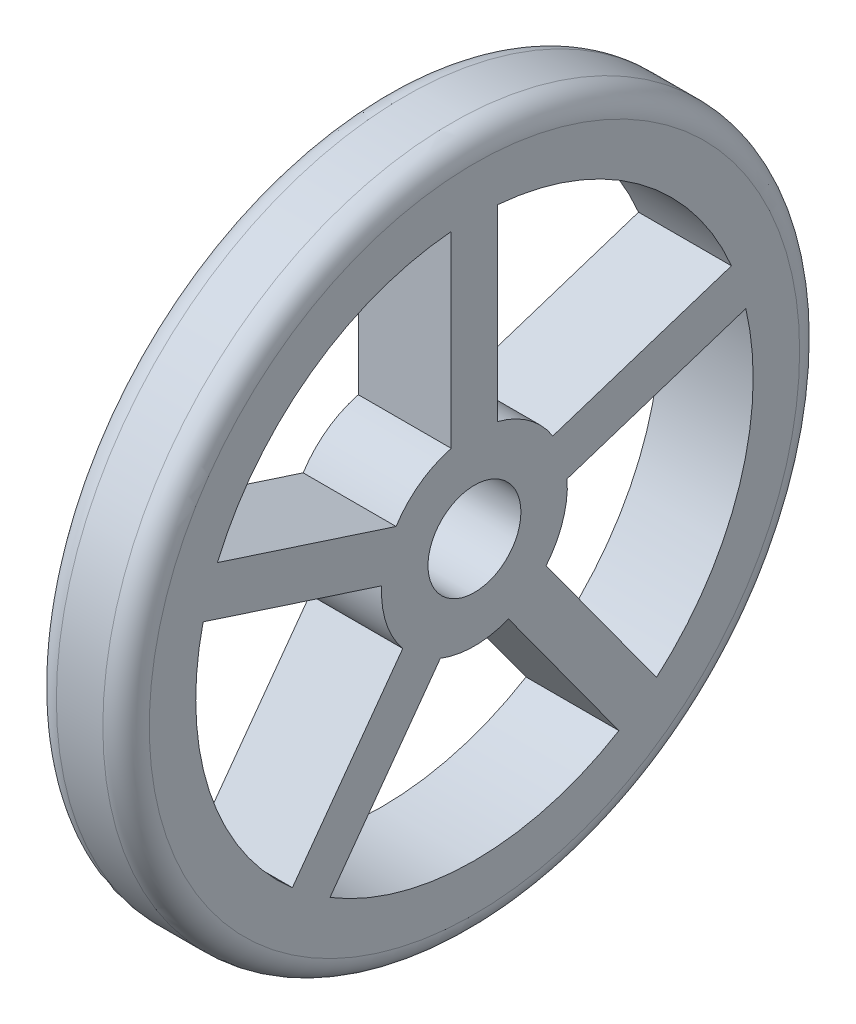
ISO-10303-21;
HEADER;
FILE_DESCRIPTION(('STEP AP214'),'2;1');
FILE_NAME('part.step','',(''),(''),'','','');
FILE_SCHEMA(('AUTOMOTIVE_DESIGN { 1 0 10303 214 1 1 1 1 }'));
ENDSEC;
DATA;
#1=APPLICATION_CONTEXT('core data for automotive mechanical design processes');
#2=APPLICATION_PROTOCOL_DEFINITION('international standard','automotive_design',2000,#1);
#3=PRODUCT_CONTEXT('',#1,'mechanical');
#4=PRODUCT('Part','Part','',(#3));
#5=PRODUCT_RELATED_PRODUCT_CATEGORY('part','',(#4));
#6=PRODUCT_DEFINITION_FORMATION('','',#4);
#7=PRODUCT_DEFINITION_CONTEXT('part definition',#1,'design');
#8=PRODUCT_DEFINITION('design','',#6,#7);
#9=PRODUCT_DEFINITION_SHAPE('','',#8);
#10=(LENGTH_UNIT() NAMED_UNIT(*) SI_UNIT(.MILLI.,.METRE.));
#11=(NAMED_UNIT(*) PLANE_ANGLE_UNIT() SI_UNIT($,.RADIAN.));
#12=(NAMED_UNIT(*) SI_UNIT($,.STERADIAN.) SOLID_ANGLE_UNIT());
#13=UNCERTAINTY_MEASURE_WITH_UNIT(LENGTH_MEASURE(1.E-05),#10,'distance_accuracy_value','');
#14=(GEOMETRIC_REPRESENTATION_CONTEXT(3) GLOBAL_UNCERTAINTY_ASSIGNED_CONTEXT((#13)) GLOBAL_UNIT_ASSIGNED_CONTEXT((#10,
#11,#12)) REPRESENTATION_CONTEXT('',''));
#15=CARTESIAN_POINT('',(0.,0.,0.));
#16=DIRECTION('',(0.,0.,1.));
#17=DIRECTION('',(1.,0.,0.));
#18=AXIS2_PLACEMENT_3D('',#15,#16,#17);
#19=CARTESIAN_POINT('',(40.,0.,0.));
#20=DIRECTION('',(1.,0.,0.));
#21=DIRECTION('',(0.,0.,-1.));
#22=AXIS2_PLACEMENT_3D('',#19,#20,#21);
#23=PLANE('',#22);
#24=CARTESIAN_POINT('',(40.,0.,0.));
#25=DIRECTION('',(1.,0.,0.));
#26=DIRECTION('',(0.,0.,-1.));
#27=AXIS2_PLACEMENT_3D('',#24,#25,#26);
#28=CIRCLE('',#27,140.);
#29=CARTESIAN_POINT('',(40.,0.,-140.));
#30=VERTEX_POINT('',#29);
#31=EDGE_CURVE('E11',#30,#30,#28,.T.);
#32=ORIENTED_EDGE('',*,*,#31,.T.);
#33=EDGE_LOOP('',(#32));
#34=FACE_BOUND('',#33,.T.);
#35=CARTESIAN_POINT('',(40.,0.,0.));
#36=DIRECTION('',(1.,0.,0.));
#37=DIRECTION('',(0.,0.,-1.));
#38=AXIS2_PLACEMENT_3D('',#35,#36,#37);
#39=CIRCLE('',#38,20.);
#40=CARTESIAN_POINT('',(40.,0.,-20.));
#41=VERTEX_POINT('',#40);
#42=EDGE_CURVE('E330',#41,#41,#39,.T.);
#43=ORIENTED_EDGE('',*,*,#42,.F.);
#44=EDGE_LOOP('',(#43));
#45=FACE_BOUND('',#44,.T.);
#46=DIRECTION('',(0.,-1.,0.));
#47=VECTOR('',#46,1.);
#48=CARTESIAN_POINT('',(40.,119.582607431014,-9.99999999999999));
#49=LINE('',#48,#47);
#50=CARTESIAN_POINT('',(40.,119.582607431014,-9.99999999999999));
#51=VERTEX_POINT('',#50);
#52=CARTESIAN_POINT('',(40.,38.7298334620742,-9.99999999999999));
#53=VERTEX_POINT('',#52);
#54=EDGE_CURVE('E301',#51,#53,#49,.T.);
#55=ORIENTED_EDGE('',*,*,#54,.F.);
#56=CARTESIAN_POINT('',(40.,0.,0.));
#57=DIRECTION('',(1.,0.,0.));
#58=DIRECTION('',(0.,0.,-1.));
#59=AXIS2_PLACEMENT_3D('',#56,#57,#58);
#60=CIRCLE('',#59,120.000000000001);
#61=CARTESIAN_POINT('',(40.,46.4636230908059,-110.639648089083));
#62=VERTEX_POINT('',#61);
#63=EDGE_CURVE('E299',#62,#51,#60,.T.);
#64=ORIENTED_EDGE('',*,*,#63,.F.);
#65=DIRECTION('',(0.,0.309016994374948,-0.951056516295154));
#66=VECTOR('',#65,1.);
#67=CARTESIAN_POINT('',(40.,46.4636230908059,-110.639648089083));
#68=LINE('',#67,#66);
#69=CARTESIAN_POINT('',(40.,21.4787418920467,-33.7440905453823));
#70=VERTEX_POINT('',#69);
#71=EDGE_CURVE('E307',#70,#62,#68,.T.);
#72=ORIENTED_EDGE('',*,*,#71,.F.);
#73=CARTESIAN_POINT('',(40.,0.,0.));
#74=DIRECTION('',(-1.,0.,0.));
#75=DIRECTION('',(0.,0.,-1.));
#76=AXIS2_PLACEMENT_3D('',#73,#74,#75);
#77=CIRCLE('',#76,40.0000000000014);
#78=EDGE_CURVE('E304',#53,#70,#77,.T.);
#79=ORIENTED_EDGE('',*,*,#78,.F.);
#80=EDGE_LOOP('',(#55,#64,#72,#79));
#81=FACE_BOUND('',#80,.T.);
#82=DIRECTION('',(0.,1.,0.));
#83=VECTOR('',#82,1.);
#84=CARTESIAN_POINT('',(40.,119.582607431014,10.));
#85=LINE('',#84,#83);
#86=CARTESIAN_POINT('',(40.,38.7298334620742,10.));
#87=VERTEX_POINT('',#86);
#88=CARTESIAN_POINT('',(40.,119.582607431014,10.));
#89=VERTEX_POINT('',#88);
#90=EDGE_CURVE('E270',#87,#89,#85,.T.);
#91=ORIENTED_EDGE('',*,*,#90,.F.);
#92=CARTESIAN_POINT('',(40.,0.,0.));
#93=DIRECTION('',(-1.,0.,0.));
#94=DIRECTION('',(0.,0.,-1.));
#95=AXIS2_PLACEMENT_3D('',#92,#93,#94);
#96=CIRCLE('',#95,40.);
#97=CARTESIAN_POINT('',(40.,21.4787418920439,33.7440905453823));
#98=VERTEX_POINT('',#97);
#99=EDGE_CURVE('E268',#98,#87,#96,.T.);
#100=ORIENTED_EDGE('',*,*,#99,.F.);
#101=DIRECTION('',(0.,-0.309016994374947,-0.951056516295154));
#102=VECTOR('',#101,1.);
#103=CARTESIAN_POINT('',(40.,46.4636230908027,110.639648089082));
#104=LINE('',#103,#102);
#105=CARTESIAN_POINT('',(40.,46.4636230908027,110.639648089082));
#106=VERTEX_POINT('',#105);
#107=EDGE_CURVE('E276',#106,#98,#104,.T.);
#108=ORIENTED_EDGE('',*,*,#107,.F.);
#109=CARTESIAN_POINT('',(40.,0.,0.));
#110=DIRECTION('',(1.,0.,0.));
#111=DIRECTION('',(0.,0.,-1.));
#112=AXIS2_PLACEMENT_3D('',#109,#110,#111);
#113=CIRCLE('',#112,120.);
#114=EDGE_CURVE('E273',#89,#106,#113,.T.);
#115=ORIENTED_EDGE('',*,*,#114,.F.);
#116=EDGE_LOOP('',(#91,#100,#108,#115));
#117=FACE_BOUND('',#116,.T.);
#118=DIRECTION('',(0.,-0.309016994374978,0.951056516295144));
#119=VECTOR('',#118,1.);
#120=CARTESIAN_POINT('',(40.,27.4424927649028,-116.819987976582));
#121=LINE('',#120,#119);
#122=CARTESIAN_POINT('',(40.,27.4424927649028,-116.819987976582));
#123=VERTEX_POINT('',#122);
#124=CARTESIAN_POINT('',(40.,2.4576115661409,-39.9244304328812));
#125=VERTEX_POINT('',#124);
#126=EDGE_CURVE('E239',#123,#125,#121,.T.);
#127=ORIENTED_EDGE('',*,*,#126,.F.);
#128=CARTESIAN_POINT('',(40.,0.,0.));
#129=DIRECTION('',(1.,0.,0.));
#130=DIRECTION('',(0.,0.,-1.));
#131=AXIS2_PLACEMENT_3D('',#128,#129,#130);
#132=CIRCLE('',#131,120.000000000001);
#133=CARTESIAN_POINT('',(40.,-90.8665091204322,-78.3790630223813));
#134=VERTEX_POINT('',#133);
#135=EDGE_CURVE('E237',#134,#123,#132,.T.);
#136=ORIENTED_EDGE('',*,*,#135,.F.);
#137=DIRECTION('',(0.,-0.809016994374947,-0.587785252292474));
#138=VECTOR('',#137,1.);
#139=CARTESIAN_POINT('',(40.,-90.8665091204322,-78.3790630223813));
#140=LINE('',#139,#138);
#141=CARTESIAN_POINT('',(40.,-25.4552409372033,-30.8549948765015));
#142=VERTEX_POINT('',#141);
#143=EDGE_CURVE('E245',#142,#134,#140,.T.);
#144=ORIENTED_EDGE('',*,*,#143,.F.);
#145=CARTESIAN_POINT('',(40.,0.,0.));
#146=DIRECTION('',(-1.,0.,0.));
#147=DIRECTION('',(0.,0.,-1.));
#148=AXIS2_PLACEMENT_3D('',#145,#146,#147);
#149=CIRCLE('',#148,40.);
#150=EDGE_CURVE('E242',#125,#142,#149,.T.);
#151=ORIENTED_EDGE('',*,*,#150,.F.);
#152=EDGE_LOOP('',(#127,#136,#144,#151));
#153=FACE_BOUND('',#152,.T.);
#154=DIRECTION('',(0.,0.809016994374947,0.587785252292474));
#155=VECTOR('',#154,1.);
#156=CARTESIAN_POINT('',(40.,-102.622214166283,-62.1987231348809));
#157=LINE('',#156,#155);
#158=CARTESIAN_POINT('',(40.,-102.622214166283,-62.1987231348809));
#159=VERTEX_POINT('',#158);
#160=CARTESIAN_POINT('',(40.,-37.2109459830542,-14.6746549890013));
#161=VERTEX_POINT('',#160);
#162=EDGE_CURVE('E208',#159,#161,#157,.T.);
#163=ORIENTED_EDGE('',*,*,#162,.F.);
#164=CARTESIAN_POINT('',(40.,0.,0.));
#165=DIRECTION('',(1.,0.,0.));
#166=DIRECTION('',(0.,0.,-1.));
#167=AXIS2_PLACEMENT_3D('',#164,#165,#166);
#168=CIRCLE('',#167,120.);
#169=CARTESIAN_POINT('',(40.,-102.622214166284,62.1987231348792));
#170=VERTEX_POINT('',#169);
#171=EDGE_CURVE('E206',#170,#159,#168,.T.);
#172=ORIENTED_EDGE('',*,*,#171,.F.);
#173=DIRECTION('',(0.,-0.809016994374948,0.587785252292473));
#174=VECTOR('',#173,1.);
#175=CARTESIAN_POINT('',(40.,-102.622214166284,62.1987231348792));
#176=LINE('',#175,#174);
#177=CARTESIAN_POINT('',(40.,-37.210945983055,14.6746549889994));
#178=VERTEX_POINT('',#177);
#179=EDGE_CURVE('E214',#178,#170,#176,.T.);
#180=ORIENTED_EDGE('',*,*,#179,.F.);
#181=CARTESIAN_POINT('',(40.,0.,0.));
#182=DIRECTION('',(-1.,0.,0.));
#183=DIRECTION('',(0.,0.,-1.));
#184=AXIS2_PLACEMENT_3D('',#181,#182,#183);
#185=CIRCLE('',#184,40.);
#186=EDGE_CURVE('E211',#161,#178,#185,.T.);
#187=ORIENTED_EDGE('',*,*,#186,.F.);
#188=EDGE_LOOP('',(#163,#172,#180,#187));
#189=FACE_BOUND('',#188,.T.);
#190=DIRECTION('',(0.,0.809016994374948,-0.587785252292473));
#191=VECTOR('',#190,1.);
#192=CARTESIAN_POINT('',(40.,-90.8665091204335,78.3790630223798));
#193=LINE('',#192,#191);
#194=CARTESIAN_POINT('',(40.,-90.8665091204335,78.3790630223798));
#195=VERTEX_POINT('',#194);
#196=CARTESIAN_POINT('',(40.,-25.4552409372048,30.8549948765002));
#197=VERTEX_POINT('',#196);
#198=EDGE_CURVE('E178',#195,#197,#193,.T.);
#199=ORIENTED_EDGE('',*,*,#198,.F.);
#200=CARTESIAN_POINT('',(40.,0.,0.));
#201=DIRECTION('',(1.,0.,0.));
#202=DIRECTION('',(0.,0.,-1.));
#203=AXIS2_PLACEMENT_3D('',#200,#201,#202);
#204=CIRCLE('',#203,119.999999999999);
#205=CARTESIAN_POINT('',(40.,27.4424927648975,116.819987976578));
#206=VERTEX_POINT('',#205);
#207=EDGE_CURVE('E170',#206,#195,#204,.T.);
#208=ORIENTED_EDGE('',*,*,#207,.F.);
#209=DIRECTION('',(0.,0.309016994374947,0.951056516295154));
#210=VECTOR('',#209,1.);
#211=CARTESIAN_POINT('',(40.,27.4424927648975,116.819987976578));
#212=LINE('',#211,#210);
#213=CARTESIAN_POINT('',(40.,2.45761156613919,39.92443043288));
#214=VERTEX_POINT('',#213);
#215=EDGE_CURVE('E192',#214,#206,#212,.T.);
#216=ORIENTED_EDGE('',*,*,#215,.F.);
#217=CARTESIAN_POINT('',(40.,0.,0.));
#218=DIRECTION('',(-1.,0.,0.));
#219=DIRECTION('',(0.,0.,-1.));
#220=AXIS2_PLACEMENT_3D('',#217,#218,#219);
#221=CIRCLE('',#220,39.9999999999987);
#222=EDGE_CURVE('E190',#197,#214,#221,.T.);
#223=ORIENTED_EDGE('',*,*,#222,.F.);
#224=EDGE_LOOP('',(#199,#208,#216,#223));
#225=FACE_BOUND('',#224,.T.);
#226=ADVANCED_FACE('F33',(#34,#45,#81,#117,#153,#189,#225),#23,.T.);
#227=CARTESIAN_POINT('',(0.,0.,0.));
#228=DIRECTION('',(1.,0.,0.));
#229=DIRECTION('',(0.,0.,-1.));
#230=AXIS2_PLACEMENT_3D('',#227,#228,#229);
#231=PLANE('',#230);
#232=CARTESIAN_POINT('',(0.,0.,0.));
#233=DIRECTION('',(1.,0.,0.));
#234=DIRECTION('',(0.,0.,-1.));
#235=AXIS2_PLACEMENT_3D('',#232,#233,#234);
#236=CIRCLE('',#235,140.);
#237=CARTESIAN_POINT('',(0.,0.,-140.));
#238=VERTEX_POINT('',#237);
#239=EDGE_CURVE('E41',#238,#238,#236,.F.);
#240=ORIENTED_EDGE('',*,*,#239,.T.);
#241=EDGE_LOOP('',(#240));
#242=FACE_BOUND('',#241,.T.);
#243=CARTESIAN_POINT('',(0.,0.,0.));
#244=DIRECTION('',(1.,0.,0.));
#245=DIRECTION('',(0.,0.,-1.));
#246=AXIS2_PLACEMENT_3D('',#243,#244,#245);
#247=CIRCLE('',#246,120.);
#248=CARTESIAN_POINT('',(0.,-102.622214166284,62.1987231348792));
#249=VERTEX_POINT('',#248);
#250=CARTESIAN_POINT('',(0.,-102.622214166283,-62.1987231348809));
#251=VERTEX_POINT('',#250);
#252=EDGE_CURVE('E186',#249,#251,#247,.T.);
#253=ORIENTED_EDGE('',*,*,#252,.T.);
#254=DIRECTION('',(0.,0.809016994374947,0.587785252292474));
#255=VECTOR('',#254,1.);
#256=CARTESIAN_POINT('',(0.,-102.622214166283,-62.1987231348809));
#257=LINE('',#256,#255);
#258=CARTESIAN_POINT('',(0.,-37.2109459830542,-14.6746549890013));
#259=VERTEX_POINT('',#258);
#260=EDGE_CURVE('E219',#251,#259,#257,.T.);
#261=ORIENTED_EDGE('',*,*,#260,.T.);
#262=CARTESIAN_POINT('',(0.,0.,0.));
#263=DIRECTION('',(-1.,0.,0.));
#264=DIRECTION('',(0.,0.,-1.));
#265=AXIS2_PLACEMENT_3D('',#262,#263,#264);
#266=CIRCLE('',#265,40.);
#267=CARTESIAN_POINT('',(0.,-37.210945983055,14.6746549889994));
#268=VERTEX_POINT('',#267);
#269=EDGE_CURVE('E222',#259,#268,#266,.T.);
#270=ORIENTED_EDGE('',*,*,#269,.T.);
#271=DIRECTION('',(0.,-0.809016994374948,0.587785252292473));
#272=VECTOR('',#271,1.);
#273=CARTESIAN_POINT('',(0.,-102.622214166284,62.1987231348792));
#274=LINE('',#273,#272);
#275=EDGE_CURVE('E209',#268,#249,#274,.T.);
#276=ORIENTED_EDGE('',*,*,#275,.T.);
#277=EDGE_LOOP('',(#253,#261,#270,#276));
#278=FACE_BOUND('',#277,.T.);
#279=CARTESIAN_POINT('',(0.,0.,0.));
#280=DIRECTION('',(-1.,0.,0.));
#281=DIRECTION('',(0.,0.,-1.));
#282=AXIS2_PLACEMENT_3D('',#279,#280,#281);
#283=CIRCLE('',#282,40.);
#284=CARTESIAN_POINT('',(0.,21.478741892044,33.7440905453823));
#285=VERTEX_POINT('',#284);
#286=CARTESIAN_POINT('',(0.,38.7298334620742,10.));
#287=VERTEX_POINT('',#286);
#288=EDGE_CURVE('E267',#285,#287,#283,.T.);
#289=ORIENTED_EDGE('',*,*,#288,.T.);
#290=DIRECTION('',(0.,1.,0.));
#291=VECTOR('',#290,1.);
#292=CARTESIAN_POINT('',(0.,119.582607431014,10.));
#293=LINE('',#292,#291);
#294=CARTESIAN_POINT('',(0.,119.582607431014,10.));
#295=VERTEX_POINT('',#294);
#296=EDGE_CURVE('E281',#287,#295,#293,.T.);
#297=ORIENTED_EDGE('',*,*,#296,.T.);
#298=CARTESIAN_POINT('',(0.,0.,0.));
#299=DIRECTION('',(1.,0.,0.));
#300=DIRECTION('',(0.,0.,-1.));
#301=AXIS2_PLACEMENT_3D('',#298,#299,#300);
#302=CIRCLE('',#301,120.);
#303=CARTESIAN_POINT('',(0.,46.4636230908026,110.639648089082));
#304=VERTEX_POINT('',#303);
#305=EDGE_CURVE('E284',#295,#304,#302,.T.);
#306=ORIENTED_EDGE('',*,*,#305,.T.);
#307=DIRECTION('',(0.,-0.309016994374947,-0.951056516295154));
#308=VECTOR('',#307,1.);
#309=CARTESIAN_POINT('',(0.,46.4636230908027,110.639648089082));
#310=LINE('',#309,#308);
#311=EDGE_CURVE('E271',#304,#285,#310,.T.);
#312=ORIENTED_EDGE('',*,*,#311,.T.);
#313=EDGE_LOOP('',(#289,#297,#306,#312));
#314=FACE_BOUND('',#313,.T.);
#315=CARTESIAN_POINT('',(0.,0.,0.));
#316=DIRECTION('',(1.,0.,0.));
#317=DIRECTION('',(0.,0.,-1.));
#318=AXIS2_PLACEMENT_3D('',#315,#316,#317);
#319=CIRCLE('',#318,20.);
#320=CARTESIAN_POINT('',(0.,0.,-20.));
#321=VERTEX_POINT('',#320);
#322=EDGE_CURVE('E329',#321,#321,#319,.T.);
#323=ORIENTED_EDGE('',*,*,#322,.T.);
#324=EDGE_LOOP('',(#323));
#325=FACE_BOUND('',#324,.T.);
#326=CARTESIAN_POINT('',(0.,0.,0.));
#327=DIRECTION('',(1.,0.,0.));
#328=DIRECTION('',(0.,0.,-1.));
#329=AXIS2_PLACEMENT_3D('',#326,#327,#328);
#330=CIRCLE('',#329,120.000000000001);
#331=CARTESIAN_POINT('',(0.,46.4636230908059,-110.639648089083));
#332=VERTEX_POINT('',#331);
#333=CARTESIAN_POINT('',(0.,119.582607431014,-9.99999999999999));
#334=VERTEX_POINT('',#333);
#335=EDGE_CURVE('E298',#332,#334,#330,.T.);
#336=ORIENTED_EDGE('',*,*,#335,.T.);
#337=DIRECTION('',(0.,-1.,0.));
#338=VECTOR('',#337,1.);
#339=CARTESIAN_POINT('',(0.,119.582607431014,-9.99999999999999));
#340=LINE('',#339,#338);
#341=CARTESIAN_POINT('',(0.,38.7298334620742,-9.99999999999999));
#342=VERTEX_POINT('',#341);
#343=EDGE_CURVE('E312',#334,#342,#340,.T.);
#344=ORIENTED_EDGE('',*,*,#343,.T.);
#345=CARTESIAN_POINT('',(0.,0.,0.));
#346=DIRECTION('',(-1.,0.,0.));
#347=DIRECTION('',(0.,0.,-1.));
#348=AXIS2_PLACEMENT_3D('',#345,#346,#347);
#349=CIRCLE('',#348,40.0000000000014);
#350=CARTESIAN_POINT('',(0.,21.4787418920463,-33.7440905453823));
#351=VERTEX_POINT('',#350);
#352=EDGE_CURVE('E315',#342,#351,#349,.T.);
#353=ORIENTED_EDGE('',*,*,#352,.T.);
#354=DIRECTION('',(0.,0.309016994374948,-0.951056516295154));
#355=VECTOR('',#354,1.);
#356=CARTESIAN_POINT('',(0.,46.4636230908059,-110.639648089083));
#357=LINE('',#356,#355);
#358=EDGE_CURVE('E302',#351,#332,#357,.T.);
#359=ORIENTED_EDGE('',*,*,#358,.T.);
#360=EDGE_LOOP('',(#336,#344,#353,#359));
#361=FACE_BOUND('',#360,.T.);
#362=CARTESIAN_POINT('',(0.,0.,0.));
#363=DIRECTION('',(1.,0.,0.));
#364=DIRECTION('',(0.,0.,-1.));
#365=AXIS2_PLACEMENT_3D('',#362,#363,#364);
#366=CIRCLE('',#365,120.000000000001);
#367=CARTESIAN_POINT('',(0.,-90.8665091204322,-78.3790630223813));
#368=VERTEX_POINT('',#367);
#369=CARTESIAN_POINT('',(0.,27.4424927649028,-116.819987976582));
#370=VERTEX_POINT('',#369);
#371=EDGE_CURVE('E236',#368,#370,#366,.T.);
#372=ORIENTED_EDGE('',*,*,#371,.T.);
#373=DIRECTION('',(0.,-0.309016994374978,0.951056516295144));
#374=VECTOR('',#373,1.);
#375=CARTESIAN_POINT('',(0.,27.4424927649028,-116.819987976582));
#376=LINE('',#375,#374);
#377=CARTESIAN_POINT('',(0.,2.4576115661409,-39.9244304328812));
#378=VERTEX_POINT('',#377);
#379=EDGE_CURVE('E250',#370,#378,#376,.T.);
#380=ORIENTED_EDGE('',*,*,#379,.T.);
#381=CARTESIAN_POINT('',(0.,0.,0.));
#382=DIRECTION('',(-1.,0.,0.));
#383=DIRECTION('',(0.,0.,-1.));
#384=AXIS2_PLACEMENT_3D('',#381,#382,#383);
#385=CIRCLE('',#384,40.);
#386=CARTESIAN_POINT('',(0.,-25.4552409372033,-30.8549948765015));
#387=VERTEX_POINT('',#386);
#388=EDGE_CURVE('E253',#378,#387,#385,.T.);
#389=ORIENTED_EDGE('',*,*,#388,.T.);
#390=DIRECTION('',(0.,-0.809016994374947,-0.587785252292474));
#391=VECTOR('',#390,1.);
#392=CARTESIAN_POINT('',(0.,-90.8665091204322,-78.3790630223813));
#393=LINE('',#392,#391);
#394=EDGE_CURVE('E240',#387,#368,#393,.T.);
#395=ORIENTED_EDGE('',*,*,#394,.T.);
#396=EDGE_LOOP('',(#372,#380,#389,#395));
#397=FACE_BOUND('',#396,.T.);
#398=CARTESIAN_POINT('',(0.,0.,0.));
#399=DIRECTION('',(1.,0.,0.));
#400=DIRECTION('',(0.,0.,-1.));
#401=AXIS2_PLACEMENT_3D('',#398,#399,#400);
#402=CIRCLE('',#401,119.999999999999);
#403=CARTESIAN_POINT('',(0.,27.4424927648975,116.819987976578));
#404=VERTEX_POINT('',#403);
#405=CARTESIAN_POINT('',(0.,-90.8665091204335,78.3790630223798));
#406=VERTEX_POINT('',#405);
#407=EDGE_CURVE('E56',#404,#406,#402,.T.);
#408=ORIENTED_EDGE('',*,*,#407,.T.);
#409=DIRECTION('',(0.,0.809016994374948,-0.587785252292473));
#410=VECTOR('',#409,1.);
#411=CARTESIAN_POINT('',(0.,-90.8665091204335,78.3790630223798));
#412=LINE('',#411,#410);
#413=CARTESIAN_POINT('',(0.,-25.4552409372048,30.8549948765002));
#414=VERTEX_POINT('',#413);
#415=EDGE_CURVE('E185',#406,#414,#412,.T.);
#416=ORIENTED_EDGE('',*,*,#415,.T.);
#417=CARTESIAN_POINT('',(0.,0.,0.));
#418=DIRECTION('',(-1.,0.,0.));
#419=DIRECTION('',(0.,0.,-1.));
#420=AXIS2_PLACEMENT_3D('',#417,#418,#419);
#421=CIRCLE('',#420,39.9999999999987);
#422=CARTESIAN_POINT('',(0.,2.45761156613884,39.92443043288));
#423=VERTEX_POINT('',#422);
#424=EDGE_CURVE('E198',#414,#423,#421,.T.);
#425=ORIENTED_EDGE('',*,*,#424,.T.);
#426=DIRECTION('',(0.,0.309016994374947,0.951056516295154));
#427=VECTOR('',#426,1.);
#428=CARTESIAN_POINT('',(0.,27.4424927648975,116.819987976578));
#429=LINE('',#428,#427);
#430=EDGE_CURVE('E179',#423,#404,#429,.T.);
#431=ORIENTED_EDGE('',*,*,#430,.T.);
#432=EDGE_LOOP('',(#408,#416,#425,#431));
#433=FACE_BOUND('',#432,.T.);
#434=ADVANCED_FACE('F343',(#242,#278,#314,#325,#361,#397,#433),#231,.F.);
#435=CARTESIAN_POINT('',(40.,0.,0.));
#436=DIRECTION('',(-1.,0.,0.));
#437=DIRECTION('',(0.,0.,1.));
#438=AXIS2_PLACEMENT_3D('',#435,#436,#437);
#439=CYLINDRICAL_SURFACE('',#438,150.);
#440=CARTESIAN_POINT('',(10.,0.,0.));
#441=DIRECTION('',(1.,0.,0.));
#442=DIRECTION('',(0.,0.,-1.));
#443=AXIS2_PLACEMENT_3D('',#440,#441,#442);
#444=CIRCLE('',#443,150.);
#445=CARTESIAN_POINT('',(10.,0.,-150.));
#446=VERTEX_POINT('',#445);
#447=EDGE_CURVE('E338',#446,#446,#444,.T.);
#448=ORIENTED_EDGE('',*,*,#447,.T.);
#449=EDGE_LOOP('',(#448));
#450=FACE_BOUND('',#449,.T.);
#451=CARTESIAN_POINT('',(30.,0.,0.));
#452=DIRECTION('',(1.,0.,0.));
#453=DIRECTION('',(0.,0.,-1.));
#454=AXIS2_PLACEMENT_3D('',#451,#452,#453);
#455=CIRCLE('',#454,150.);
#456=CARTESIAN_POINT('',(30.,0.,-150.));
#457=VERTEX_POINT('',#456);
#458=EDGE_CURVE('E333',#457,#457,#455,.F.);
#459=ORIENTED_EDGE('',*,*,#458,.T.);
#460=EDGE_LOOP('',(#459));
#461=FACE_BOUND('',#460,.T.);
#462=ADVANCED_FACE('F352',(#450,#461),#439,.T.);
#463=CARTESIAN_POINT('',(40.,0.,0.));
#464=DIRECTION('',(-1.,0.,0.));
#465=DIRECTION('',(0.,0.,1.));
#466=AXIS2_PLACEMENT_3D('',#463,#464,#465);
#467=CYLINDRICAL_SURFACE('',#466,20.);
#468=ORIENTED_EDGE('',*,*,#42,.T.);
#469=EDGE_LOOP('',(#468));
#470=FACE_BOUND('',#469,.T.);
#471=ORIENTED_EDGE('',*,*,#322,.F.);
#472=EDGE_LOOP('',(#471));
#473=FACE_BOUND('',#472,.T.);
#474=ADVANCED_FACE('F355',(#470,#473),#467,.F.);
#475=CARTESIAN_POINT('',(40.,0.,0.));
#476=DIRECTION('',(-1.,0.,0.));
#477=DIRECTION('',(0.,0.,1.));
#478=AXIS2_PLACEMENT_3D('',#475,#476,#477);
#479=CYLINDRICAL_SURFACE('',#478,120.000000000001);
#480=ORIENTED_EDGE('',*,*,#335,.F.);
#481=DIRECTION('',(-1.,0.,0.));
#482=VECTOR('',#481,1.);
#483=CARTESIAN_POINT('',(40.,46.4636230908059,-110.639648089083));
#484=LINE('',#483,#482);
#485=EDGE_CURVE('E309',#62,#332,#484,.T.);
#486=ORIENTED_EDGE('',*,*,#485,.F.);
#487=ORIENTED_EDGE('',*,*,#63,.T.);
#488=DIRECTION('',(-1.,0.,0.));
#489=VECTOR('',#488,1.);
#490=CARTESIAN_POINT('',(40.,119.582607431014,-9.99999999999999));
#491=LINE('',#490,#489);
#492=EDGE_CURVE('E326',#51,#334,#491,.T.);
#493=ORIENTED_EDGE('',*,*,#492,.T.);
#494=EDGE_LOOP('',(#480,#486,#487,#493));
#495=FACE_BOUND('',#494,.T.);
#496=ADVANCED_FACE('F455',(#495),#479,.F.);
#497=CARTESIAN_POINT('',(40.,119.582607431014,-9.99999999999999));
#498=DIRECTION('',(0.,0.,-1.));
#499=DIRECTION('',(0.,1.,0.));
#500=AXIS2_PLACEMENT_3D('',#497,#498,#499);
#501=PLANE('',#500);
#502=ORIENTED_EDGE('',*,*,#343,.F.);
#503=ORIENTED_EDGE('',*,*,#492,.F.);
#504=ORIENTED_EDGE('',*,*,#54,.T.);
#505=DIRECTION('',(-1.,0.,0.));
#506=VECTOR('',#505,1.);
#507=CARTESIAN_POINT('',(40.,38.7298334620742,-9.99999999999999));
#508=LINE('',#507,#506);
#509=EDGE_CURVE('E324',#53,#342,#508,.T.);
#510=ORIENTED_EDGE('',*,*,#509,.T.);
#511=EDGE_LOOP('',(#502,#503,#504,#510));
#512=FACE_BOUND('',#511,.T.);
#513=ADVANCED_FACE('F451',(#512),#501,.T.);
#514=CARTESIAN_POINT('',(40.,0.,0.));
#515=DIRECTION('',(-1.,0.,0.));
#516=DIRECTION('',(0.,0.,1.));
#517=AXIS2_PLACEMENT_3D('',#514,#515,#516);
#518=CYLINDRICAL_SURFACE('',#517,40.0000000000014);
#519=ORIENTED_EDGE('',*,*,#352,.F.);
#520=ORIENTED_EDGE('',*,*,#509,.F.);
#521=ORIENTED_EDGE('',*,*,#78,.T.);
#522=DIRECTION('',(-1.,0.,0.));
#523=VECTOR('',#522,1.);
#524=CARTESIAN_POINT('',(40.,21.4787418920463,-33.7440905453823));
#525=LINE('',#524,#523);
#526=EDGE_CURVE('E322',#70,#351,#525,.T.);
#527=ORIENTED_EDGE('',*,*,#526,.T.);
#528=EDGE_LOOP('',(#519,#520,#521,#527));
#529=FACE_BOUND('',#528,.T.);
#530=ADVANCED_FACE('F447',(#529),#518,.T.);
#531=CARTESIAN_POINT('',(40.,46.4636230908059,-110.639648089083));
#532=DIRECTION('',(0.,0.951056516295154,0.309016994374948));
#533=DIRECTION('',(0.,-0.309016994374948,0.951056516295154));
#534=AXIS2_PLACEMENT_3D('',#531,#532,#533);
#535=PLANE('',#534);
#536=ORIENTED_EDGE('',*,*,#358,.F.);
#537=ORIENTED_EDGE('',*,*,#526,.F.);
#538=ORIENTED_EDGE('',*,*,#71,.T.);
#539=ORIENTED_EDGE('',*,*,#485,.T.);
#540=EDGE_LOOP('',(#536,#537,#538,#539));
#541=FACE_BOUND('',#540,.T.);
#542=ADVANCED_FACE('F443',(#541),#535,.T.);
#543=CARTESIAN_POINT('',(40.,0.,0.));
#544=DIRECTION('',(-1.,0.,0.));
#545=DIRECTION('',(0.,0.,1.));
#546=AXIS2_PLACEMENT_3D('',#543,#544,#545);
#547=CYLINDRICAL_SURFACE('',#546,40.);
#548=ORIENTED_EDGE('',*,*,#288,.F.);
#549=DIRECTION('',(-1.,0.,0.));
#550=VECTOR('',#549,1.);
#551=CARTESIAN_POINT('',(40.,21.4787418920439,33.7440905453823));
#552=LINE('',#551,#550);
#553=EDGE_CURVE('E278',#98,#285,#552,.T.);
#554=ORIENTED_EDGE('',*,*,#553,.F.);
#555=ORIENTED_EDGE('',*,*,#99,.T.);
#556=DIRECTION('',(-1.,0.,0.));
#557=VECTOR('',#556,1.);
#558=CARTESIAN_POINT('',(40.,38.7298334620742,10.));
#559=LINE('',#558,#557);
#560=EDGE_CURVE('E295',#87,#287,#559,.T.);
#561=ORIENTED_EDGE('',*,*,#560,.T.);
#562=EDGE_LOOP('',(#548,#554,#555,#561));
#563=FACE_BOUND('',#562,.T.);
#564=ADVANCED_FACE('F439',(#563),#547,.T.);
#565=CARTESIAN_POINT('',(40.,119.582607431014,10.));
#566=DIRECTION('',(0.,0.,1.));
#567=DIRECTION('',(0.,-1.,0.));
#568=AXIS2_PLACEMENT_3D('',#565,#566,#567);
#569=PLANE('',#568);
#570=ORIENTED_EDGE('',*,*,#296,.F.);
#571=ORIENTED_EDGE('',*,*,#560,.F.);
#572=ORIENTED_EDGE('',*,*,#90,.T.);
#573=DIRECTION('',(-1.,0.,0.));
#574=VECTOR('',#573,1.);
#575=CARTESIAN_POINT('',(40.,119.582607431014,10.));
#576=LINE('',#575,#574);
#577=EDGE_CURVE('E293',#89,#295,#576,.T.);
#578=ORIENTED_EDGE('',*,*,#577,.T.);
#579=EDGE_LOOP('',(#570,#571,#572,#578));
#580=FACE_BOUND('',#579,.T.);
#581=ADVANCED_FACE('F435',(#580),#569,.T.);
#582=CARTESIAN_POINT('',(40.,0.,0.));
#583=DIRECTION('',(-1.,0.,0.));
#584=DIRECTION('',(0.,0.,1.));
#585=AXIS2_PLACEMENT_3D('',#582,#583,#584);
#586=CYLINDRICAL_SURFACE('',#585,120.);
#587=ORIENTED_EDGE('',*,*,#305,.F.);
#588=ORIENTED_EDGE('',*,*,#577,.F.);
#589=ORIENTED_EDGE('',*,*,#114,.T.);
#590=DIRECTION('',(-1.,0.,0.));
#591=VECTOR('',#590,1.);
#592=CARTESIAN_POINT('',(40.,46.4636230908026,110.639648089082));
#593=LINE('',#592,#591);
#594=EDGE_CURVE('E291',#106,#304,#593,.T.);
#595=ORIENTED_EDGE('',*,*,#594,.T.);
#596=EDGE_LOOP('',(#587,#588,#589,#595));
#597=FACE_BOUND('',#596,.T.);
#598=ADVANCED_FACE('F431',(#597),#586,.F.);
#599=CARTESIAN_POINT('',(40.,46.4636230908027,110.639648089082));
#600=DIRECTION('',(0.,0.951056516295154,-0.309016994374947));
#601=DIRECTION('',(0.,0.309016994374947,0.951056516295154));
#602=AXIS2_PLACEMENT_3D('',#599,#600,#601);
#603=PLANE('',#602);
#604=ORIENTED_EDGE('',*,*,#311,.F.);
#605=ORIENTED_EDGE('',*,*,#594,.F.);
#606=ORIENTED_EDGE('',*,*,#107,.T.);
#607=ORIENTED_EDGE('',*,*,#553,.T.);
#608=EDGE_LOOP('',(#604,#605,#606,#607));
#609=FACE_BOUND('',#608,.T.);
#610=ADVANCED_FACE('F427',(#609),#603,.T.);
#611=CARTESIAN_POINT('',(40.,0.,0.));
#612=DIRECTION('',(-1.,0.,0.));
#613=DIRECTION('',(0.,0.,1.));
#614=AXIS2_PLACEMENT_3D('',#611,#612,#613);
#615=CYLINDRICAL_SURFACE('',#614,120.000000000001);
#616=ORIENTED_EDGE('',*,*,#371,.F.);
#617=DIRECTION('',(-1.,0.,0.));
#618=VECTOR('',#617,1.);
#619=CARTESIAN_POINT('',(40.,-90.8665091204322,-78.3790630223813));
#620=LINE('',#619,#618);
#621=EDGE_CURVE('E247',#134,#368,#620,.T.);
#622=ORIENTED_EDGE('',*,*,#621,.F.);
#623=ORIENTED_EDGE('',*,*,#135,.T.);
#624=DIRECTION('',(-1.,0.,0.));
#625=VECTOR('',#624,1.);
#626=CARTESIAN_POINT('',(40.,27.4424927649028,-116.819987976582));
#627=LINE('',#626,#625);
#628=EDGE_CURVE('E264',#123,#370,#627,.T.);
#629=ORIENTED_EDGE('',*,*,#628,.T.);
#630=EDGE_LOOP('',(#616,#622,#623,#629));
#631=FACE_BOUND('',#630,.T.);
#632=ADVANCED_FACE('F423',(#631),#615,.F.);
#633=CARTESIAN_POINT('',(40.,27.4424927649028,-116.819987976582));
#634=DIRECTION('',(0.,-0.951056516295144,-0.309016994374978));
#635=DIRECTION('',(0.,0.309016994374978,-0.951056516295144));
#636=AXIS2_PLACEMENT_3D('',#633,#634,#635);
#637=PLANE('',#636);
#638=ORIENTED_EDGE('',*,*,#379,.F.);
#639=ORIENTED_EDGE('',*,*,#628,.F.);
#640=ORIENTED_EDGE('',*,*,#126,.T.);
#641=DIRECTION('',(-1.,0.,0.));
#642=VECTOR('',#641,1.);
#643=CARTESIAN_POINT('',(40.,2.4576115661409,-39.9244304328812));
#644=LINE('',#643,#642);
#645=EDGE_CURVE('E262',#125,#378,#644,.T.);
#646=ORIENTED_EDGE('',*,*,#645,.T.);
#647=EDGE_LOOP('',(#638,#639,#640,#646));
#648=FACE_BOUND('',#647,.T.);
#649=ADVANCED_FACE('F419',(#648),#637,.T.);
#650=CARTESIAN_POINT('',(40.,0.,0.));
#651=DIRECTION('',(-1.,0.,0.));
#652=DIRECTION('',(0.,0.,1.));
#653=AXIS2_PLACEMENT_3D('',#650,#651,#652);
#654=CYLINDRICAL_SURFACE('',#653,40.);
#655=ORIENTED_EDGE('',*,*,#388,.F.);
#656=ORIENTED_EDGE('',*,*,#645,.F.);
#657=ORIENTED_EDGE('',*,*,#150,.T.);
#658=DIRECTION('',(-1.,0.,0.));
#659=VECTOR('',#658,1.);
#660=CARTESIAN_POINT('',(40.,-25.4552409372033,-30.8549948765015));
#661=LINE('',#660,#659);
#662=EDGE_CURVE('E260',#142,#387,#661,.T.);
#663=ORIENTED_EDGE('',*,*,#662,.T.);
#664=EDGE_LOOP('',(#655,#656,#657,#663));
#665=FACE_BOUND('',#664,.T.);
#666=ADVANCED_FACE('F415',(#665),#654,.T.);
#667=CARTESIAN_POINT('',(40.,-90.8665091204322,-78.3790630223813));
#668=DIRECTION('',(0.,0.587785252292474,-0.809016994374947));
#669=DIRECTION('',(0.,0.809016994374947,0.587785252292474));
#670=AXIS2_PLACEMENT_3D('',#667,#668,#669);
#671=PLANE('',#670);
#672=ORIENTED_EDGE('',*,*,#394,.F.);
#673=ORIENTED_EDGE('',*,*,#662,.F.);
#674=ORIENTED_EDGE('',*,*,#143,.T.);
#675=ORIENTED_EDGE('',*,*,#621,.T.);
#676=EDGE_LOOP('',(#672,#673,#674,#675));
#677=FACE_BOUND('',#676,.T.);
#678=ADVANCED_FACE('F412',(#677),#671,.T.);
#679=CARTESIAN_POINT('',(40.,0.,0.));
#680=DIRECTION('',(-1.,0.,0.));
#681=DIRECTION('',(0.,0.,1.));
#682=AXIS2_PLACEMENT_3D('',#679,#680,#681);
#683=CYLINDRICAL_SURFACE('',#682,120.);
#684=ORIENTED_EDGE('',*,*,#252,.F.);
#685=DIRECTION('',(-1.,0.,0.));
#686=VECTOR('',#685,1.);
#687=CARTESIAN_POINT('',(40.,-102.622214166284,62.1987231348792));
#688=LINE('',#687,#686);
#689=EDGE_CURVE('E216',#170,#249,#688,.T.);
#690=ORIENTED_EDGE('',*,*,#689,.F.);
#691=ORIENTED_EDGE('',*,*,#171,.T.);
#692=DIRECTION('',(-1.,0.,0.));
#693=VECTOR('',#692,1.);
#694=CARTESIAN_POINT('',(40.,-102.622214166283,-62.1987231348809));
#695=LINE('',#694,#693);
#696=EDGE_CURVE('E233',#159,#251,#695,.T.);
#697=ORIENTED_EDGE('',*,*,#696,.T.);
#698=EDGE_LOOP('',(#684,#690,#691,#697));
#699=FACE_BOUND('',#698,.T.);
#700=ADVANCED_FACE('F394',(#699),#683,.F.);
#701=CARTESIAN_POINT('',(40.,-102.622214166283,-62.1987231348809));
#702=DIRECTION('',(0.,-0.587785252292474,0.809016994374947));
#703=DIRECTION('',(0.,-0.809016994374947,-0.587785252292474));
#704=AXIS2_PLACEMENT_3D('',#701,#702,#703);
#705=PLANE('',#704);
#706=ORIENTED_EDGE('',*,*,#260,.F.);
#707=ORIENTED_EDGE('',*,*,#696,.F.);
#708=ORIENTED_EDGE('',*,*,#162,.T.);
#709=DIRECTION('',(-1.,0.,0.));
#710=VECTOR('',#709,1.);
#711=CARTESIAN_POINT('',(40.,-37.2109459830542,-14.6746549890013));
#712=LINE('',#711,#710);
#713=EDGE_CURVE('E231',#161,#259,#712,.T.);
#714=ORIENTED_EDGE('',*,*,#713,.T.);
#715=EDGE_LOOP('',(#706,#707,#708,#714));
#716=FACE_BOUND('',#715,.T.);
#717=ADVANCED_FACE('F387',(#716),#705,.T.);
#718=CARTESIAN_POINT('',(40.,0.,0.));
#719=DIRECTION('',(-1.,0.,0.));
#720=DIRECTION('',(0.,0.,1.));
#721=AXIS2_PLACEMENT_3D('',#718,#719,#720);
#722=CYLINDRICAL_SURFACE('',#721,40.);
#723=ORIENTED_EDGE('',*,*,#269,.F.);
#724=ORIENTED_EDGE('',*,*,#713,.F.);
#725=ORIENTED_EDGE('',*,*,#186,.T.);
#726=DIRECTION('',(-1.,0.,0.));
#727=VECTOR('',#726,1.);
#728=CARTESIAN_POINT('',(40.,-37.210945983055,14.6746549889994));
#729=LINE('',#728,#727);
#730=EDGE_CURVE('E229',#178,#268,#729,.T.);
#731=ORIENTED_EDGE('',*,*,#730,.T.);
#732=EDGE_LOOP('',(#723,#724,#725,#731));
#733=FACE_BOUND('',#732,.T.);
#734=ADVANCED_FACE('F390',(#733),#722,.T.);
#735=CARTESIAN_POINT('',(40.,-102.622214166284,62.1987231348792));
#736=DIRECTION('',(0.,-0.587785252292473,-0.809016994374948));
#737=DIRECTION('',(0.,0.809016994374948,-0.587785252292473));
#738=AXIS2_PLACEMENT_3D('',#735,#736,#737);
#739=PLANE('',#738);
#740=ORIENTED_EDGE('',*,*,#275,.F.);
#741=ORIENTED_EDGE('',*,*,#730,.F.);
#742=ORIENTED_EDGE('',*,*,#179,.T.);
#743=ORIENTED_EDGE('',*,*,#689,.T.);
#744=EDGE_LOOP('',(#740,#741,#742,#743));
#745=FACE_BOUND('',#744,.T.);
#746=ADVANCED_FACE('F397',(#745),#739,.T.);
#747=CARTESIAN_POINT('',(40.,0.,0.));
#748=DIRECTION('',(-1.,0.,0.));
#749=DIRECTION('',(0.,0.,1.));
#750=AXIS2_PLACEMENT_3D('',#747,#748,#749);
#751=CYLINDRICAL_SURFACE('',#750,119.999999999999);
#752=ORIENTED_EDGE('',*,*,#407,.F.);
#753=DIRECTION('',(-1.,0.,0.));
#754=VECTOR('',#753,1.);
#755=CARTESIAN_POINT('',(40.,27.4424927648975,116.819987976578));
#756=LINE('',#755,#754);
#757=EDGE_CURVE('E174',#206,#404,#756,.T.);
#758=ORIENTED_EDGE('',*,*,#757,.F.);
#759=ORIENTED_EDGE('',*,*,#207,.T.);
#760=DIRECTION('',(-1.,0.,0.));
#761=VECTOR('',#760,1.);
#762=CARTESIAN_POINT('',(40.,-90.8665091204335,78.3790630223798));
#763=LINE('',#762,#761);
#764=EDGE_CURVE('E173',#195,#406,#763,.T.);
#765=ORIENTED_EDGE('',*,*,#764,.T.);
#766=EDGE_LOOP('',(#752,#758,#759,#765));
#767=FACE_BOUND('',#766,.T.);
#768=ADVANCED_FACE('F172',(#767),#751,.F.);
#769=CARTESIAN_POINT('',(40.,-90.8665091204335,78.3790630223798));
#770=DIRECTION('',(0.,0.587785252292473,0.809016994374948));
#771=DIRECTION('',(0.,-0.809016994374948,0.587785252292473));
#772=AXIS2_PLACEMENT_3D('',#769,#770,#771);
#773=PLANE('',#772);
#774=ORIENTED_EDGE('',*,*,#415,.F.);
#775=ORIENTED_EDGE('',*,*,#764,.F.);
#776=ORIENTED_EDGE('',*,*,#198,.T.);
#777=DIRECTION('',(-1.,0.,0.));
#778=VECTOR('',#777,1.);
#779=CARTESIAN_POINT('',(40.,-25.4552409372048,30.8549948765002));
#780=LINE('',#779,#778);
#781=EDGE_CURVE('E187',#197,#414,#780,.T.);
#782=ORIENTED_EDGE('',*,*,#781,.T.);
#783=EDGE_LOOP('',(#774,#775,#776,#782));
#784=FACE_BOUND('',#783,.T.);
#785=ADVANCED_FACE('F182',(#784),#773,.T.);
#786=CARTESIAN_POINT('',(40.,0.,0.));
#787=DIRECTION('',(-1.,0.,0.));
#788=DIRECTION('',(0.,0.,1.));
#789=AXIS2_PLACEMENT_3D('',#786,#787,#788);
#790=CYLINDRICAL_SURFACE('',#789,39.9999999999987);
#791=ORIENTED_EDGE('',*,*,#424,.F.);
#792=ORIENTED_EDGE('',*,*,#781,.F.);
#793=ORIENTED_EDGE('',*,*,#222,.T.);
#794=DIRECTION('',(-1.,0.,0.));
#795=VECTOR('',#794,1.);
#796=CARTESIAN_POINT('',(40.,2.45761156613884,39.92443043288));
#797=LINE('',#796,#795);
#798=EDGE_CURVE('E48',#214,#423,#797,.T.);
#799=ORIENTED_EDGE('',*,*,#798,.T.);
#800=EDGE_LOOP('',(#791,#792,#793,#799));
#801=FACE_BOUND('',#800,.T.);
#802=ADVANCED_FACE('F556',(#801),#790,.T.);
#803=CARTESIAN_POINT('',(40.,27.4424927648975,116.819987976578));
#804=DIRECTION('',(0.,-0.951056516295154,0.309016994374947));
#805=DIRECTION('',(0.,-0.309016994374947,-0.951056516295154));
#806=AXIS2_PLACEMENT_3D('',#803,#804,#805);
#807=PLANE('',#806);
#808=ORIENTED_EDGE('',*,*,#430,.F.);
#809=ORIENTED_EDGE('',*,*,#798,.F.);
#810=ORIENTED_EDGE('',*,*,#215,.T.);
#811=ORIENTED_EDGE('',*,*,#757,.T.);
#812=EDGE_LOOP('',(#808,#809,#810,#811));
#813=FACE_BOUND('',#812,.T.);
#814=ADVANCED_FACE('F349',(#813),#807,.T.);
#815=CARTESIAN_POINT('',(10.,0.,0.));
#816=DIRECTION('',(1.,0.,0.));
#817=DIRECTION('',(0.,0.,-1.));
#818=AXIS2_PLACEMENT_3D('',#815,#816,#817);
#819=TOROIDAL_SURFACE('',#818,140.,10.);
#820=ORIENTED_EDGE('',*,*,#239,.F.);
#821=EDGE_LOOP('',(#820));
#822=FACE_BOUND('',#821,.T.);
#823=ORIENTED_EDGE('',*,*,#447,.F.);
#824=EDGE_LOOP('',(#823));
#825=FACE_BOUND('',#824,.T.);
#826=ADVANCED_FACE('F346',(#822,#825),#819,.T.);
#827=CARTESIAN_POINT('',(30.,0.,0.));
#828=DIRECTION('',(1.,0.,0.));
#829=DIRECTION('',(0.,0.,-1.));
#830=AXIS2_PLACEMENT_3D('',#827,#828,#829);
#831=TOROIDAL_SURFACE('',#830,140.,10.);
#832=ORIENTED_EDGE('',*,*,#458,.F.);
#833=EDGE_LOOP('',(#832));
#834=FACE_BOUND('',#833,.T.);
#835=ORIENTED_EDGE('',*,*,#31,.F.);
#836=EDGE_LOOP('',(#835));
#837=FACE_BOUND('',#836,.T.);
#838=ADVANCED_FACE('F35',(#834,#837),#831,.T.);
#839=CLOSED_SHELL('',(#226,#434,#462,#474,#496,#513,#530,#542,#564,#581,#598,#610,#632,#649,
#666,#678,#700,#717,#734,#746,#768,#785,#802,#814,#826,#838));
#840=MANIFOLD_SOLID_BREP('B2',#839);
#841=ADVANCED_BREP_SHAPE_REPRESENTATION('',(#18,#840),#14);
#842=SHAPE_DEFINITION_REPRESENTATION(#9,#841);
ENDSEC;
END-ISO-10303-21;
